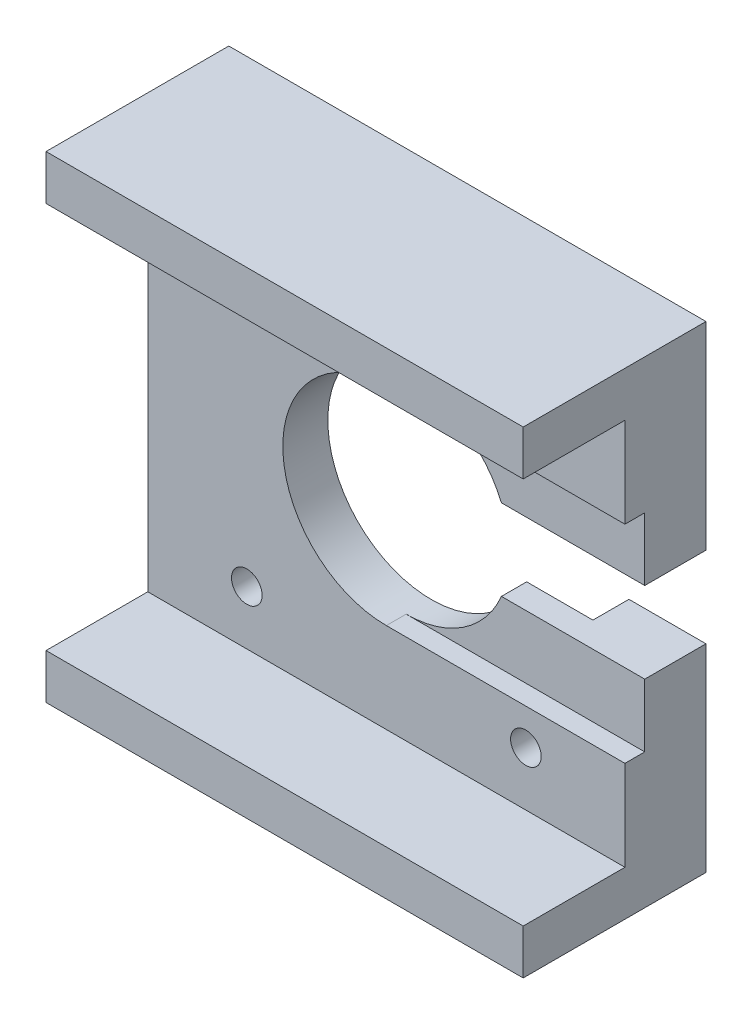
ISO-10303-21;
HEADER;
FILE_DESCRIPTION(('STEP AP214'),'2;1');
FILE_NAME('part.step','',(''),(''),'','','');
FILE_SCHEMA(('AUTOMOTIVE_DESIGN { 1 0 10303 214 1 1 1 1 }'));
ENDSEC;
DATA;
#1=APPLICATION_CONTEXT('core data for automotive mechanical design processes');
#2=APPLICATION_PROTOCOL_DEFINITION('international standard','automotive_design',2000,#1);
#3=PRODUCT_CONTEXT('',#1,'mechanical');
#4=PRODUCT('Part','Part','',(#3));
#5=PRODUCT_RELATED_PRODUCT_CATEGORY('part','',(#4));
#6=PRODUCT_DEFINITION_FORMATION('','',#4);
#7=PRODUCT_DEFINITION_CONTEXT('part definition',#1,'design');
#8=PRODUCT_DEFINITION('design','',#6,#7);
#9=PRODUCT_DEFINITION_SHAPE('','',#8);
#10=(LENGTH_UNIT() NAMED_UNIT(*) SI_UNIT(.MILLI.,.METRE.));
#11=(NAMED_UNIT(*) PLANE_ANGLE_UNIT() SI_UNIT($,.RADIAN.));
#12=(NAMED_UNIT(*) SI_UNIT($,.STERADIAN.) SOLID_ANGLE_UNIT());
#13=UNCERTAINTY_MEASURE_WITH_UNIT(LENGTH_MEASURE(1.E-05),#10,'distance_accuracy_value','');
#14=(GEOMETRIC_REPRESENTATION_CONTEXT(3) GLOBAL_UNCERTAINTY_ASSIGNED_CONTEXT((#13)) GLOBAL_UNIT_ASSIGNED_CONTEXT((#10,
#11,#12)) REPRESENTATION_CONTEXT('',''));
#15=CARTESIAN_POINT('',(0.,0.,0.));
#16=DIRECTION('',(0.,0.,1.));
#17=DIRECTION('',(1.,0.,0.));
#18=AXIS2_PLACEMENT_3D('',#15,#16,#17);
#19=CARTESIAN_POINT('',(15.5,15.5,16.3));
#20=DIRECTION('',(0.,0.,-1.));
#21=DIRECTION('',(-1.,0.,0.));
#22=AXIS2_PLACEMENT_3D('',#19,#20,#21);
#23=CYLINDRICAL_SURFACE('',#22,1.7);
#24=CARTESIAN_POINT('',(15.5,15.5,5.));
#25=DIRECTION('',(0.,0.,1.));
#26=DIRECTION('',(1.,0.,0.));
#27=AXIS2_PLACEMENT_3D('',#24,#25,#26);
#28=CIRCLE('',#27,1.7);
#29=CARTESIAN_POINT('',(17.2,15.5,5.));
#30=VERTEX_POINT('',#29);
#31=EDGE_CURVE('E242',#30,#30,#28,.T.);
#32=ORIENTED_EDGE('',*,*,#31,.T.);
#33=EDGE_LOOP('',(#32));
#34=FACE_BOUND('',#33,.T.);
#35=CARTESIAN_POINT('',(15.5,15.5,-3.5));
#36=DIRECTION('',(0.,0.,-1.));
#37=DIRECTION('',(-1.,0.,0.));
#38=AXIS2_PLACEMENT_3D('',#35,#36,#37);
#39=CIRCLE('',#38,1.7);
#40=CARTESIAN_POINT('',(13.8,15.5,-3.5));
#41=VERTEX_POINT('',#40);
#42=EDGE_CURVE('E50',#41,#41,#39,.F.);
#43=ORIENTED_EDGE('',*,*,#42,.F.);
#44=EDGE_LOOP('',(#43));
#45=FACE_BOUND('',#44,.T.);
#46=ADVANCED_FACE('F46',(#34,#45),#23,.F.);
#47=CARTESIAN_POINT('',(15.5000000000002,-15.4999999999998,16.3));
#48=DIRECTION('',(0.,0.,-1.));
#49=DIRECTION('',(-1.,0.,0.));
#50=AXIS2_PLACEMENT_3D('',#47,#48,#49);
#51=CYLINDRICAL_SURFACE('',#50,1.7);
#52=CARTESIAN_POINT('',(15.5000000000002,-15.4999999999998,5.));
#53=DIRECTION('',(0.,0.,1.));
#54=DIRECTION('',(1.,0.,0.));
#55=AXIS2_PLACEMENT_3D('',#52,#53,#54);
#56=CIRCLE('',#55,1.7);
#57=CARTESIAN_POINT('',(17.2000000000002,-15.4999999999998,5.));
#58=VERTEX_POINT('',#57);
#59=EDGE_CURVE('E183',#58,#58,#56,.T.);
#60=ORIENTED_EDGE('',*,*,#59,.T.);
#61=EDGE_LOOP('',(#60));
#62=FACE_BOUND('',#61,.T.);
#63=CARTESIAN_POINT('',(15.5000000000002,-15.4999999999998,-3.5));
#64=DIRECTION('',(0.,0.,-1.));
#65=DIRECTION('',(-1.,0.,0.));
#66=AXIS2_PLACEMENT_3D('',#63,#64,#65);
#67=CIRCLE('',#66,1.7);
#68=CARTESIAN_POINT('',(13.8000000000002,-15.4999999999998,-3.5));
#69=VERTEX_POINT('',#68);
#70=EDGE_CURVE('E397',#69,#69,#67,.F.);
#71=ORIENTED_EDGE('',*,*,#70,.F.);
#72=EDGE_LOOP('',(#71));
#73=FACE_BOUND('',#72,.T.);
#74=ADVANCED_FACE('F411',(#62,#73),#51,.F.);
#75=CARTESIAN_POINT('',(-15.5,-15.5,16.3));
#76=DIRECTION('',(0.,0.,-1.));
#77=DIRECTION('',(-1.,0.,0.));
#78=AXIS2_PLACEMENT_3D('',#75,#76,#77);
#79=CYLINDRICAL_SURFACE('',#78,1.7);
#80=CARTESIAN_POINT('',(-15.5,-15.5,5.));
#81=DIRECTION('',(0.,0.,1.));
#82=DIRECTION('',(1.,0.,0.));
#83=AXIS2_PLACEMENT_3D('',#80,#81,#82);
#84=CIRCLE('',#83,1.7);
#85=CARTESIAN_POINT('',(-13.8,-15.5,5.));
#86=VERTEX_POINT('',#85);
#87=EDGE_CURVE('E234',#86,#86,#84,.T.);
#88=ORIENTED_EDGE('',*,*,#87,.T.);
#89=EDGE_LOOP('',(#88));
#90=FACE_BOUND('',#89,.T.);
#91=CARTESIAN_POINT('',(-15.5,-15.5,-3.5));
#92=DIRECTION('',(0.,0.,-1.));
#93=DIRECTION('',(-1.,0.,0.));
#94=AXIS2_PLACEMENT_3D('',#91,#92,#93);
#95=CIRCLE('',#94,1.7);
#96=CARTESIAN_POINT('',(-17.2,-15.5,-3.5));
#97=VERTEX_POINT('',#96);
#98=EDGE_CURVE('E393',#97,#97,#95,.F.);
#99=ORIENTED_EDGE('',*,*,#98,.F.);
#100=EDGE_LOOP('',(#99));
#101=FACE_BOUND('',#100,.T.);
#102=ADVANCED_FACE('F417',(#90,#101),#79,.F.);
#103=CARTESIAN_POINT('',(-15.5000000000001,15.4999999999999,16.3));
#104=DIRECTION('',(0.,0.,-1.));
#105=DIRECTION('',(-1.,0.,0.));
#106=AXIS2_PLACEMENT_3D('',#103,#104,#105);
#107=CYLINDRICAL_SURFACE('',#106,1.7);
#108=CARTESIAN_POINT('',(-15.5000000000001,15.4999999999999,5.));
#109=DIRECTION('',(0.,0.,1.));
#110=DIRECTION('',(1.,0.,0.));
#111=AXIS2_PLACEMENT_3D('',#108,#109,#110);
#112=CIRCLE('',#111,1.7);
#113=CARTESIAN_POINT('',(-13.8000000000001,15.4999999999999,5.));
#114=VERTEX_POINT('',#113);
#115=EDGE_CURVE('E238',#114,#114,#112,.T.);
#116=ORIENTED_EDGE('',*,*,#115,.T.);
#117=EDGE_LOOP('',(#116));
#118=FACE_BOUND('',#117,.T.);
#119=CARTESIAN_POINT('',(-15.5000000000001,15.4999999999999,-3.5));
#120=DIRECTION('',(0.,0.,-1.));
#121=DIRECTION('',(-1.,0.,0.));
#122=AXIS2_PLACEMENT_3D('',#119,#120,#121);
#123=CIRCLE('',#122,1.7);
#124=CARTESIAN_POINT('',(-17.2000000000001,15.4999999999999,-3.5));
#125=VERTEX_POINT('',#124);
#126=EDGE_CURVE('E389',#125,#125,#123,.F.);
#127=ORIENTED_EDGE('',*,*,#126,.F.);
#128=EDGE_LOOP('',(#127));
#129=FACE_BOUND('',#128,.T.);
#130=ADVANCED_FACE('F470',(#118,#129),#107,.F.);
#131=CARTESIAN_POINT('',(0.,0.,0.));
#132=DIRECTION('',(0.,0.,1.));
#133=DIRECTION('',(1.,0.,0.));
#134=AXIS2_PLACEMENT_3D('',#131,#132,#133);
#135=PLANE('',#134);
#136=DIRECTION('',(1.,0.,0.));
#137=VECTOR('',#136,1.);
#138=CARTESIAN_POINT('',(0.,-4.5,0.));
#139=LINE('',#138,#137);
#140=CARTESIAN_POINT('',(10.5830052442584,-4.5,0.));
#141=VERTEX_POINT('',#140);
#142=CARTESIAN_POINT('',(17.9443584449264,-4.5,0.));
#143=VERTEX_POINT('',#142);
#144=EDGE_CURVE('E294',#141,#143,#139,.T.);
#145=ORIENTED_EDGE('',*,*,#144,.T.);
#146=CARTESIAN_POINT('',(0.,0.,0.));
#147=DIRECTION('',(0.,0.,-1.));
#148=DIRECTION('',(-1.,0.,0.));
#149=AXIS2_PLACEMENT_3D('',#146,#147,#148);
#150=CIRCLE('',#149,18.5);
#151=CARTESIAN_POINT('',(17.9443584449264,4.5,0.));
#152=VERTEX_POINT('',#151);
#153=EDGE_CURVE('E178',#143,#152,#150,.T.);
#154=ORIENTED_EDGE('',*,*,#153,.T.);
#155=DIRECTION('',(1.,0.,0.));
#156=VECTOR('',#155,1.);
#157=CARTESIAN_POINT('',(0.,4.5,0.));
#158=LINE('',#157,#156);
#159=CARTESIAN_POINT('',(10.5830052442584,4.5,0.));
#160=VERTEX_POINT('',#159);
#161=EDGE_CURVE('E298',#160,#152,#158,.T.);
#162=ORIENTED_EDGE('',*,*,#161,.F.);
#163=CARTESIAN_POINT('',(0.,0.,0.));
#164=DIRECTION('',(0.,0.,1.));
#165=DIRECTION('',(1.,0.,0.));
#166=AXIS2_PLACEMENT_3D('',#163,#164,#165);
#167=CIRCLE('',#166,11.5);
#168=EDGE_CURVE('E290',#160,#141,#167,.T.);
#169=ORIENTED_EDGE('',*,*,#168,.T.);
#170=EDGE_LOOP('',(#145,#154,#162,#169));
#171=FACE_BOUND('',#170,.T.);
#172=ADVANCED_FACE('F467',(#171),#135,.F.);
#173=CARTESIAN_POINT('',(26.5,26.5,5.));
#174=DIRECTION('',(-1.,0.,0.));
#175=DIRECTION('',(0.,0.,1.));
#176=AXIS2_PLACEMENT_3D('',#173,#174,#175);
#177=PLANE('',#176);
#178=DIRECTION('',(0.,0.,1.));
#179=VECTOR('',#178,1.);
#180=CARTESIAN_POINT('',(26.5,11.5,2.8));
#181=LINE('',#180,#179);
#182=CARTESIAN_POINT('',(26.5,11.5,2.8));
#183=VERTEX_POINT('',#182);
#184=CARTESIAN_POINT('',(26.5,11.5,5.));
#185=VERTEX_POINT('',#184);
#186=EDGE_CURVE('E268',#183,#185,#181,.T.);
#187=ORIENTED_EDGE('',*,*,#186,.F.);
#188=DIRECTION('',(0.,1.,0.));
#189=VECTOR('',#188,1.);
#190=CARTESIAN_POINT('',(26.5,0.,2.8));
#191=LINE('',#190,#189);
#192=CARTESIAN_POINT('',(26.5,4.5,2.8));
#193=VERTEX_POINT('',#192);
#194=EDGE_CURVE('E250',#193,#183,#191,.T.);
#195=ORIENTED_EDGE('',*,*,#194,.F.);
#196=DIRECTION('',(0.,0.,1.));
#197=VECTOR('',#196,1.);
#198=CARTESIAN_POINT('',(26.5,4.5,0.));
#199=LINE('',#198,#197);
#200=CARTESIAN_POINT('',(26.5,4.5,-4.));
#201=VERTEX_POINT('',#200);
#202=EDGE_CURVE('E311',#201,#193,#199,.T.);
#203=ORIENTED_EDGE('',*,*,#202,.F.);
#204=DIRECTION('',(0.,-1.,0.));
#205=VECTOR('',#204,1.);
#206=CARTESIAN_POINT('',(26.5,0.,-4.));
#207=LINE('',#206,#205);
#208=CARTESIAN_POINT('',(26.5,26.5,-4.));
#209=VERTEX_POINT('',#208);
#210=EDGE_CURVE('E224',#209,#201,#207,.T.);
#211=ORIENTED_EDGE('',*,*,#210,.F.);
#212=DIRECTION('',(0.,0.,-1.));
#213=VECTOR('',#212,1.);
#214=CARTESIAN_POINT('',(26.5,26.5,5.));
#215=LINE('',#214,#213);
#216=CARTESIAN_POINT('',(26.5,26.5,16.3));
#217=VERTEX_POINT('',#216);
#218=EDGE_CURVE('E11',#217,#209,#215,.T.);
#219=ORIENTED_EDGE('',*,*,#218,.F.);
#220=DIRECTION('',(0.,1.,0.));
#221=VECTOR('',#220,1.);
#222=CARTESIAN_POINT('',(26.5,0.,16.3));
#223=LINE('',#222,#221);
#224=CARTESIAN_POINT('',(26.5,21.5,16.3));
#225=VERTEX_POINT('',#224);
#226=EDGE_CURVE('E351',#225,#217,#223,.T.);
#227=ORIENTED_EDGE('',*,*,#226,.F.);
#228=DIRECTION('',(0.,0.,-1.));
#229=VECTOR('',#228,1.);
#230=CARTESIAN_POINT('',(26.5,21.5,16.3));
#231=LINE('',#230,#229);
#232=CARTESIAN_POINT('',(26.5,21.5,5.));
#233=VERTEX_POINT('',#232);
#234=EDGE_CURVE('E369',#225,#233,#231,.T.);
#235=ORIENTED_EDGE('',*,*,#234,.T.);
#236=DIRECTION('',(0.,1.,0.));
#237=VECTOR('',#236,1.);
#238=CARTESIAN_POINT('',(26.5,26.5,5.));
#239=LINE('',#238,#237);
#240=EDGE_CURVE('E373',#185,#233,#239,.T.);
#241=ORIENTED_EDGE('',*,*,#240,.F.);
#242=EDGE_LOOP('',(#187,#195,#203,#211,#219,#227,#235,#241));
#243=FACE_BOUND('',#242,.T.);
#244=ADVANCED_FACE('F465',(#243),#177,.F.);
#245=CARTESIAN_POINT('',(0.,0.,5.));
#246=DIRECTION('',(0.,0.,1.));
#247=DIRECTION('',(1.,0.,0.));
#248=AXIS2_PLACEMENT_3D('',#245,#246,#247);
#249=PLANE('',#248);
#250=ORIENTED_EDGE('',*,*,#115,.F.);
#251=EDGE_LOOP('',(#250));
#252=FACE_BOUND('',#251,.T.);
#253=ORIENTED_EDGE('',*,*,#87,.F.);
#254=EDGE_LOOP('',(#253));
#255=FACE_BOUND('',#254,.T.);
#256=ORIENTED_EDGE('',*,*,#59,.F.);
#257=EDGE_LOOP('',(#256));
#258=FACE_BOUND('',#257,.T.);
#259=ORIENTED_EDGE('',*,*,#31,.F.);
#260=EDGE_LOOP('',(#259));
#261=FACE_BOUND('',#260,.T.);
#262=DIRECTION('',(1.,0.,0.));
#263=VECTOR('',#262,1.);
#264=CARTESIAN_POINT('',(0.,-11.5,5.));
#265=LINE('',#264,#263);
#266=CARTESIAN_POINT('',(0.,-11.5,5.));
#267=VERTEX_POINT('',#266);
#268=CARTESIAN_POINT('',(26.5,-11.5,5.));
#269=VERTEX_POINT('',#268);
#270=EDGE_CURVE('E251',#267,#269,#265,.T.);
#271=ORIENTED_EDGE('',*,*,#270,.F.);
#272=CARTESIAN_POINT('',(0.,0.,5.));
#273=DIRECTION('',(0.,0.,1.));
#274=DIRECTION('',(1.,0.,0.));
#275=AXIS2_PLACEMENT_3D('',#272,#273,#274);
#276=CIRCLE('',#275,11.5);
#277=CARTESIAN_POINT('',(0.,11.5,5.));
#278=VERTEX_POINT('',#277);
#279=EDGE_CURVE('E295',#278,#267,#276,.T.);
#280=ORIENTED_EDGE('',*,*,#279,.F.);
#281=DIRECTION('',(1.,0.,0.));
#282=VECTOR('',#281,1.);
#283=CARTESIAN_POINT('',(0.,11.5,5.));
#284=LINE('',#283,#282);
#285=EDGE_CURVE('E246',#278,#185,#284,.T.);
#286=ORIENTED_EDGE('',*,*,#285,.T.);
#287=ORIENTED_EDGE('',*,*,#240,.T.);
#288=DIRECTION('',(1.,0.,0.));
#289=VECTOR('',#288,1.);
#290=CARTESIAN_POINT('',(0.,21.5,5.));
#291=LINE('',#290,#289);
#292=CARTESIAN_POINT('',(-26.5,21.5,5.));
#293=VERTEX_POINT('',#292);
#294=EDGE_CURVE('E346',#293,#233,#291,.T.);
#295=ORIENTED_EDGE('',*,*,#294,.F.);
#296=DIRECTION('',(0.,-1.,0.));
#297=VECTOR('',#296,1.);
#298=CARTESIAN_POINT('',(-26.5,26.5,5.));
#299=LINE('',#298,#297);
#300=CARTESIAN_POINT('',(-26.5,-21.5,5.));
#301=VERTEX_POINT('',#300);
#302=EDGE_CURVE('E378',#293,#301,#299,.T.);
#303=ORIENTED_EDGE('',*,*,#302,.T.);
#304=DIRECTION('',(1.,0.,0.));
#305=VECTOR('',#304,1.);
#306=CARTESIAN_POINT('',(0.,-21.5,5.));
#307=LINE('',#306,#305);
#308=CARTESIAN_POINT('',(26.5,-21.5,5.));
#309=VERTEX_POINT('',#308);
#310=EDGE_CURVE('E310',#301,#309,#307,.T.);
#311=ORIENTED_EDGE('',*,*,#310,.T.);
#312=EDGE_CURVE('E374',#309,#269,#239,.T.);
#313=ORIENTED_EDGE('',*,*,#312,.T.);
#314=EDGE_LOOP('',(#271,#280,#286,#287,#295,#303,#311,#313));
#315=FACE_BOUND('',#314,.T.);
#316=ADVANCED_FACE('F445',(#252,#255,#258,#261,#315),#249,.T.);
#317=CARTESIAN_POINT('',(0.,0.,0.));
#318=DIRECTION('',(0.,0.,1.));
#319=DIRECTION('',(1.,0.,0.));
#320=AXIS2_PLACEMENT_3D('',#317,#318,#319);
#321=CYLINDRICAL_SURFACE('',#320,11.5);
#322=CARTESIAN_POINT('',(0.,0.,2.8));
#323=DIRECTION('',(0.,0.,1.));
#324=DIRECTION('',(1.,0.,0.));
#325=AXIS2_PLACEMENT_3D('',#322,#323,#324);
#326=CIRCLE('',#325,11.5);
#327=CARTESIAN_POINT('',(10.5830052442584,-4.5,2.8));
#328=VERTEX_POINT('',#327);
#329=CARTESIAN_POINT('',(0.,-11.5,2.8));
#330=VERTEX_POINT('',#329);
#331=EDGE_CURVE('E289',#328,#330,#326,.F.);
#332=ORIENTED_EDGE('',*,*,#331,.F.);
#333=DIRECTION('',(0.,0.,1.));
#334=VECTOR('',#333,1.);
#335=CARTESIAN_POINT('',(10.5830052442584,-4.5,0.));
#336=LINE('',#335,#334);
#337=EDGE_CURVE('E302',#141,#328,#336,.T.);
#338=ORIENTED_EDGE('',*,*,#337,.F.);
#339=ORIENTED_EDGE('',*,*,#168,.F.);
#340=DIRECTION('',(0.,0.,1.));
#341=VECTOR('',#340,1.);
#342=CARTESIAN_POINT('',(10.5830052442584,4.5,0.));
#343=LINE('',#342,#341);
#344=CARTESIAN_POINT('',(10.5830052442584,4.5,2.8));
#345=VERTEX_POINT('',#344);
#346=EDGE_CURVE('E306',#160,#345,#343,.T.);
#347=ORIENTED_EDGE('',*,*,#346,.T.);
#348=CARTESIAN_POINT('',(0.,11.5,2.8));
#349=VERTEX_POINT('',#348);
#350=EDGE_CURVE('E72',#349,#345,#326,.F.);
#351=ORIENTED_EDGE('',*,*,#350,.F.);
#352=DIRECTION('',(0.,0.,1.));
#353=VECTOR('',#352,1.);
#354=CARTESIAN_POINT('',(0.,11.5,2.8));
#355=LINE('',#354,#353);
#356=EDGE_CURVE('E281',#349,#278,#355,.T.);
#357=ORIENTED_EDGE('',*,*,#356,.T.);
#358=ORIENTED_EDGE('',*,*,#279,.T.);
#359=DIRECTION('',(0.,0.,1.));
#360=VECTOR('',#359,1.);
#361=CARTESIAN_POINT('',(0.,-11.5,2.8));
#362=LINE('',#361,#360);
#363=EDGE_CURVE('E278',#330,#267,#362,.T.);
#364=ORIENTED_EDGE('',*,*,#363,.F.);
#365=EDGE_LOOP('',(#332,#338,#339,#347,#351,#357,#358,#364));
#366=FACE_BOUND('',#365,.T.);
#367=ADVANCED_FACE('F439',(#366),#321,.F.);
#368=CARTESIAN_POINT('',(0.,4.5,0.));
#369=DIRECTION('',(0.,-1.,0.));
#370=DIRECTION('',(0.,0.,-1.));
#371=AXIS2_PLACEMENT_3D('',#368,#369,#370);
#372=PLANE('',#371);
#373=ORIENTED_EDGE('',*,*,#202,.T.);
#374=DIRECTION('',(1.,0.,0.));
#375=VECTOR('',#374,1.);
#376=CARTESIAN_POINT('',(0.,4.5,2.8));
#377=LINE('',#376,#375);
#378=EDGE_CURVE('E247',#345,#193,#377,.T.);
#379=ORIENTED_EDGE('',*,*,#378,.F.);
#380=ORIENTED_EDGE('',*,*,#346,.F.);
#381=ORIENTED_EDGE('',*,*,#161,.T.);
#382=DIRECTION('',(0.,0.,1.));
#383=VECTOR('',#382,1.);
#384=CARTESIAN_POINT('',(17.9443584449264,4.5,-4.));
#385=LINE('',#384,#383);
#386=CARTESIAN_POINT('',(17.9443584449264,4.5,-4.));
#387=VERTEX_POINT('',#386);
#388=EDGE_CURVE('E64',#387,#152,#385,.T.);
#389=ORIENTED_EDGE('',*,*,#388,.F.);
#390=DIRECTION('',(-1.,0.,0.));
#391=VECTOR('',#390,1.);
#392=CARTESIAN_POINT('',(0.,4.5,-4.));
#393=LINE('',#392,#391);
#394=EDGE_CURVE('E200',#201,#387,#393,.T.);
#395=ORIENTED_EDGE('',*,*,#394,.F.);
#396=EDGE_LOOP('',(#373,#379,#380,#381,#389,#395));
#397=FACE_BOUND('',#396,.T.);
#398=ADVANCED_FACE('F436',(#397),#372,.T.);
#399=CARTESIAN_POINT('',(0.,-4.5,0.));
#400=DIRECTION('',(0.,-1.,0.));
#401=DIRECTION('',(0.,0.,-1.));
#402=AXIS2_PLACEMENT_3D('',#399,#400,#401);
#403=PLANE('',#402);
#404=DIRECTION('',(-1.,0.,0.));
#405=VECTOR('',#404,1.);
#406=CARTESIAN_POINT('',(0.,-4.5,2.8));
#407=LINE('',#406,#405);
#408=CARTESIAN_POINT('',(26.5,-4.5,2.8));
#409=VERTEX_POINT('',#408);
#410=EDGE_CURVE('E265',#409,#328,#407,.T.);
#411=ORIENTED_EDGE('',*,*,#410,.F.);
#412=DIRECTION('',(0.,0.,1.));
#413=VECTOR('',#412,1.);
#414=CARTESIAN_POINT('',(26.5,-4.5,0.));
#415=LINE('',#414,#413);
#416=CARTESIAN_POINT('',(26.5,-4.5,-4.));
#417=VERTEX_POINT('',#416);
#418=EDGE_CURVE('E190',#417,#409,#415,.T.);
#419=ORIENTED_EDGE('',*,*,#418,.F.);
#420=DIRECTION('',(1.,0.,0.));
#421=VECTOR('',#420,1.);
#422=CARTESIAN_POINT('',(0.,-4.5,-4.));
#423=LINE('',#422,#421);
#424=CARTESIAN_POINT('',(17.9443584449264,-4.5,-4.));
#425=VERTEX_POINT('',#424);
#426=EDGE_CURVE('E186',#425,#417,#423,.T.);
#427=ORIENTED_EDGE('',*,*,#426,.F.);
#428=DIRECTION('',(0.,0.,1.));
#429=VECTOR('',#428,1.);
#430=CARTESIAN_POINT('',(17.9443584449264,-4.5,-4.));
#431=LINE('',#430,#429);
#432=EDGE_CURVE('E173',#425,#143,#431,.T.);
#433=ORIENTED_EDGE('',*,*,#432,.T.);
#434=ORIENTED_EDGE('',*,*,#144,.F.);
#435=ORIENTED_EDGE('',*,*,#337,.T.);
#436=EDGE_LOOP('',(#411,#419,#427,#433,#434,#435));
#437=FACE_BOUND('',#436,.T.);
#438=ADVANCED_FACE('F188',(#437),#403,.F.);
#439=DIRECTION('',(0.,1.,0.));
#440=VECTOR('',#439,1.);
#441=CARTESIAN_POINT('',(26.5,0.,2.8));
#442=LINE('',#441,#440);
#443=CARTESIAN_POINT('',(26.5,-11.5,2.8));
#444=VERTEX_POINT('',#443);
#445=EDGE_CURVE('E262',#444,#409,#442,.T.);
#446=ORIENTED_EDGE('',*,*,#445,.F.);
#447=DIRECTION('',(0.,0.,1.));
#448=VECTOR('',#447,1.);
#449=CARTESIAN_POINT('',(26.5,-11.5,2.8));
#450=LINE('',#449,#448);
#451=EDGE_CURVE('E274',#444,#269,#450,.T.);
#452=ORIENTED_EDGE('',*,*,#451,.T.);
#453=ORIENTED_EDGE('',*,*,#312,.F.);
#454=DIRECTION('',(0.,0.,-1.));
#455=VECTOR('',#454,1.);
#456=CARTESIAN_POINT('',(26.5,-21.5,16.3));
#457=LINE('',#456,#455);
#458=CARTESIAN_POINT('',(26.5,-21.5,16.3));
#459=VERTEX_POINT('',#458);
#460=EDGE_CURVE('E335',#459,#309,#457,.T.);
#461=ORIENTED_EDGE('',*,*,#460,.F.);
#462=DIRECTION('',(0.,1.,0.));
#463=VECTOR('',#462,1.);
#464=CARTESIAN_POINT('',(26.5,0.,16.3));
#465=LINE('',#464,#463);
#466=CARTESIAN_POINT('',(26.5,-26.5,16.3));
#467=VERTEX_POINT('',#466);
#468=EDGE_CURVE('E332',#467,#459,#465,.T.);
#469=ORIENTED_EDGE('',*,*,#468,.F.);
#470=DIRECTION('',(0.,0.,-1.));
#471=VECTOR('',#470,1.);
#472=CARTESIAN_POINT('',(26.5,-26.5,5.));
#473=LINE('',#472,#471);
#474=CARTESIAN_POINT('',(26.5,-26.5,-4.));
#475=VERTEX_POINT('',#474);
#476=EDGE_CURVE('E381',#467,#475,#473,.T.);
#477=ORIENTED_EDGE('',*,*,#476,.T.);
#478=DIRECTION('',(0.,-1.,0.));
#479=VECTOR('',#478,1.);
#480=CARTESIAN_POINT('',(26.5,0.,-4.));
#481=LINE('',#480,#479);
#482=EDGE_CURVE('E195',#417,#475,#481,.T.);
#483=ORIENTED_EDGE('',*,*,#482,.F.);
#484=ORIENTED_EDGE('',*,*,#418,.T.);
#485=EDGE_LOOP('',(#446,#452,#453,#461,#469,#477,#483,#484));
#486=FACE_BOUND('',#485,.T.);
#487=ADVANCED_FACE('F48',(#486),#177,.F.);
#488=CARTESIAN_POINT('',(-26.5,26.5,5.));
#489=DIRECTION('',(0.,-1.,0.));
#490=DIRECTION('',(0.,0.,-1.));
#491=AXIS2_PLACEMENT_3D('',#488,#489,#490);
#492=PLANE('',#491);
#493=ORIENTED_EDGE('',*,*,#218,.T.);
#494=DIRECTION('',(1.,0.,0.));
#495=VECTOR('',#494,1.);
#496=CARTESIAN_POINT('',(0.,26.5,-4.));
#497=LINE('',#496,#495);
#498=CARTESIAN_POINT('',(-26.5,26.5,-4.));
#499=VERTEX_POINT('',#498);
#500=EDGE_CURVE('E220',#499,#209,#497,.T.);
#501=ORIENTED_EDGE('',*,*,#500,.F.);
#502=DIRECTION('',(0.,0.,-1.));
#503=VECTOR('',#502,1.);
#504=CARTESIAN_POINT('',(-26.5,26.5,5.));
#505=LINE('',#504,#503);
#506=CARTESIAN_POINT('',(-26.5,26.5,16.3));
#507=VERTEX_POINT('',#506);
#508=EDGE_CURVE('E56',#507,#499,#505,.T.);
#509=ORIENTED_EDGE('',*,*,#508,.F.);
#510=DIRECTION('',(-1.,0.,0.));
#511=VECTOR('',#510,1.);
#512=CARTESIAN_POINT('',(0.,26.5,16.3));
#513=LINE('',#512,#511);
#514=EDGE_CURVE('E355',#217,#507,#513,.T.);
#515=ORIENTED_EDGE('',*,*,#514,.F.);
#516=EDGE_LOOP('',(#493,#501,#509,#515));
#517=FACE_BOUND('',#516,.T.);
#518=ADVANCED_FACE('F477',(#517),#492,.F.);
#519=CARTESIAN_POINT('',(-26.5,26.5,5.));
#520=DIRECTION('',(1.,0.,0.));
#521=DIRECTION('',(0.,0.,-1.));
#522=AXIS2_PLACEMENT_3D('',#519,#520,#521);
#523=PLANE('',#522);
#524=ORIENTED_EDGE('',*,*,#508,.T.);
#525=DIRECTION('',(0.,1.,0.));
#526=VECTOR('',#525,1.);
#527=CARTESIAN_POINT('',(-26.5,0.,-4.));
#528=LINE('',#527,#526);
#529=CARTESIAN_POINT('',(-26.5,-26.5,-4.));
#530=VERTEX_POINT('',#529);
#531=EDGE_CURVE('E216',#530,#499,#528,.T.);
#532=ORIENTED_EDGE('',*,*,#531,.F.);
#533=DIRECTION('',(0.,0.,-1.));
#534=VECTOR('',#533,1.);
#535=CARTESIAN_POINT('',(-26.5,-26.5,5.));
#536=LINE('',#535,#534);
#537=CARTESIAN_POINT('',(-26.5,-26.5,16.3));
#538=VERTEX_POINT('',#537);
#539=EDGE_CURVE('E384',#538,#530,#536,.T.);
#540=ORIENTED_EDGE('',*,*,#539,.F.);
#541=DIRECTION('',(0.,-1.,0.));
#542=VECTOR('',#541,1.);
#543=CARTESIAN_POINT('',(-26.5,0.,16.3));
#544=LINE('',#543,#542);
#545=CARTESIAN_POINT('',(-26.5,-21.5,16.3));
#546=VERTEX_POINT('',#545);
#547=EDGE_CURVE('E324',#546,#538,#544,.T.);
#548=ORIENTED_EDGE('',*,*,#547,.F.);
#549=DIRECTION('',(0.,0.,-1.));
#550=VECTOR('',#549,1.);
#551=CARTESIAN_POINT('',(-26.5,-21.5,16.3));
#552=LINE('',#551,#550);
#553=EDGE_CURVE('E342',#546,#301,#552,.T.);
#554=ORIENTED_EDGE('',*,*,#553,.T.);
#555=ORIENTED_EDGE('',*,*,#302,.F.);
#556=DIRECTION('',(0.,0.,-1.));
#557=VECTOR('',#556,1.);
#558=CARTESIAN_POINT('',(-26.5,21.5,16.3));
#559=LINE('',#558,#557);
#560=CARTESIAN_POINT('',(-26.5,21.5,16.3));
#561=VERTEX_POINT('',#560);
#562=EDGE_CURVE('E362',#561,#293,#559,.T.);
#563=ORIENTED_EDGE('',*,*,#562,.F.);
#564=DIRECTION('',(0.,-1.,0.));
#565=VECTOR('',#564,1.);
#566=CARTESIAN_POINT('',(-26.5,0.,16.3));
#567=LINE('',#566,#565);
#568=EDGE_CURVE('E359',#507,#561,#567,.T.);
#569=ORIENTED_EDGE('',*,*,#568,.F.);
#570=EDGE_LOOP('',(#524,#532,#540,#548,#554,#555,#563,#569));
#571=FACE_BOUND('',#570,.T.);
#572=ADVANCED_FACE('F474',(#571),#523,.F.);
#573=CARTESIAN_POINT('',(-26.5,-26.5,5.));
#574=DIRECTION('',(0.,1.,0.));
#575=DIRECTION('',(0.,0.,1.));
#576=AXIS2_PLACEMENT_3D('',#573,#574,#575);
#577=PLANE('',#576);
#578=ORIENTED_EDGE('',*,*,#539,.T.);
#579=DIRECTION('',(-1.,0.,0.));
#580=VECTOR('',#579,1.);
#581=CARTESIAN_POINT('',(0.,-26.5,-4.));
#582=LINE('',#581,#580);
#583=EDGE_CURVE('E212',#475,#530,#582,.T.);
#584=ORIENTED_EDGE('',*,*,#583,.F.);
#585=ORIENTED_EDGE('',*,*,#476,.F.);
#586=DIRECTION('',(1.,0.,0.));
#587=VECTOR('',#586,1.);
#588=CARTESIAN_POINT('',(0.,-26.5,16.3));
#589=LINE('',#588,#587);
#590=EDGE_CURVE('E328',#538,#467,#589,.T.);
#591=ORIENTED_EDGE('',*,*,#590,.F.);
#592=EDGE_LOOP('',(#578,#584,#585,#591));
#593=FACE_BOUND('',#592,.T.);
#594=ADVANCED_FACE('F461',(#593),#577,.F.);
#595=CARTESIAN_POINT('',(0.,21.5,16.3));
#596=DIRECTION('',(0.,1.,0.));
#597=DIRECTION('',(0.,0.,1.));
#598=AXIS2_PLACEMENT_3D('',#595,#596,#597);
#599=PLANE('',#598);
#600=ORIENTED_EDGE('',*,*,#294,.T.);
#601=ORIENTED_EDGE('',*,*,#234,.F.);
#602=DIRECTION('',(1.,0.,0.));
#603=VECTOR('',#602,1.);
#604=CARTESIAN_POINT('',(0.,21.5,16.3));
#605=LINE('',#604,#603);
#606=EDGE_CURVE('E347',#561,#225,#605,.T.);
#607=ORIENTED_EDGE('',*,*,#606,.F.);
#608=ORIENTED_EDGE('',*,*,#562,.T.);
#609=EDGE_LOOP('',(#600,#601,#607,#608));
#610=FACE_BOUND('',#609,.T.);
#611=ADVANCED_FACE('F457',(#610),#599,.F.);
#612=CARTESIAN_POINT('',(0.,0.,16.3));
#613=DIRECTION('',(0.,0.,1.));
#614=DIRECTION('',(1.,0.,0.));
#615=AXIS2_PLACEMENT_3D('',#612,#613,#614);
#616=PLANE('',#615);
#617=ORIENTED_EDGE('',*,*,#606,.T.);
#618=ORIENTED_EDGE('',*,*,#226,.T.);
#619=ORIENTED_EDGE('',*,*,#514,.T.);
#620=ORIENTED_EDGE('',*,*,#568,.T.);
#621=EDGE_LOOP('',(#617,#618,#619,#620));
#622=FACE_BOUND('',#621,.T.);
#623=ADVANCED_FACE('F453',(#622),#616,.T.);
#624=CARTESIAN_POINT('',(0.,-21.5,16.3));
#625=DIRECTION('',(0.,1.,0.));
#626=DIRECTION('',(0.,0.,1.));
#627=AXIS2_PLACEMENT_3D('',#624,#625,#626);
#628=PLANE('',#627);
#629=ORIENTED_EDGE('',*,*,#310,.F.);
#630=ORIENTED_EDGE('',*,*,#553,.F.);
#631=DIRECTION('',(1.,0.,0.));
#632=VECTOR('',#631,1.);
#633=CARTESIAN_POINT('',(0.,-21.5,16.3));
#634=LINE('',#633,#632);
#635=EDGE_CURVE('E320',#546,#459,#634,.T.);
#636=ORIENTED_EDGE('',*,*,#635,.T.);
#637=ORIENTED_EDGE('',*,*,#460,.T.);
#638=EDGE_LOOP('',(#629,#630,#636,#637));
#639=FACE_BOUND('',#638,.T.);
#640=ADVANCED_FACE('F449',(#639),#628,.T.);
#641=CARTESIAN_POINT('',(0.,0.,16.3));
#642=DIRECTION('',(0.,0.,1.));
#643=DIRECTION('',(1.,0.,0.));
#644=AXIS2_PLACEMENT_3D('',#641,#642,#643);
#645=PLANE('',#644);
#646=ORIENTED_EDGE('',*,*,#635,.F.);
#647=ORIENTED_EDGE('',*,*,#547,.T.);
#648=ORIENTED_EDGE('',*,*,#590,.T.);
#649=ORIENTED_EDGE('',*,*,#468,.T.);
#650=EDGE_LOOP('',(#646,#647,#648,#649));
#651=FACE_BOUND('',#650,.T.);
#652=ADVANCED_FACE('F426',(#651),#645,.T.);
#653=CARTESIAN_POINT('',(0.,0.,2.8));
#654=DIRECTION('',(0.,0.,1.));
#655=DIRECTION('',(1.,0.,0.));
#656=AXIS2_PLACEMENT_3D('',#653,#654,#655);
#657=PLANE('',#656);
#658=ORIENTED_EDGE('',*,*,#331,.T.);
#659=DIRECTION('',(1.,0.,0.));
#660=VECTOR('',#659,1.);
#661=CARTESIAN_POINT('',(0.,-11.5,2.8));
#662=LINE('',#661,#660);
#663=EDGE_CURVE('E258',#330,#444,#662,.T.);
#664=ORIENTED_EDGE('',*,*,#663,.T.);
#665=ORIENTED_EDGE('',*,*,#445,.T.);
#666=ORIENTED_EDGE('',*,*,#410,.T.);
#667=EDGE_LOOP('',(#658,#664,#665,#666));
#668=FACE_BOUND('',#667,.T.);
#669=ADVANCED_FACE('F422',(#668),#657,.T.);
#670=CARTESIAN_POINT('',(0.,-11.5,2.8));
#671=DIRECTION('',(0.,-1.,0.));
#672=DIRECTION('',(1.,0.,0.));
#673=AXIS2_PLACEMENT_3D('',#670,#671,#672);
#674=PLANE('',#673);
#675=ORIENTED_EDGE('',*,*,#270,.T.);
#676=ORIENTED_EDGE('',*,*,#451,.F.);
#677=ORIENTED_EDGE('',*,*,#663,.F.);
#678=ORIENTED_EDGE('',*,*,#363,.T.);
#679=EDGE_LOOP('',(#675,#676,#677,#678));
#680=FACE_BOUND('',#679,.T.);
#681=ADVANCED_FACE('F425',(#680),#674,.F.);
#682=ORIENTED_EDGE('',*,*,#350,.T.);
#683=ORIENTED_EDGE('',*,*,#378,.T.);
#684=ORIENTED_EDGE('',*,*,#194,.T.);
#685=DIRECTION('',(1.,0.,0.));
#686=VECTOR('',#685,1.);
#687=CARTESIAN_POINT('',(0.,11.5,2.8));
#688=LINE('',#687,#686);
#689=EDGE_CURVE('E255',#349,#183,#688,.T.);
#690=ORIENTED_EDGE('',*,*,#689,.F.);
#691=EDGE_LOOP('',(#682,#683,#684,#690));
#692=FACE_BOUND('',#691,.T.);
#693=ADVANCED_FACE('F428',(#692),#657,.T.);
#694=CARTESIAN_POINT('',(0.,11.5,2.8));
#695=DIRECTION('',(0.,-1.,0.));
#696=DIRECTION('',(0.,0.,-1.));
#697=AXIS2_PLACEMENT_3D('',#694,#695,#696);
#698=PLANE('',#697);
#699=ORIENTED_EDGE('',*,*,#285,.F.);
#700=ORIENTED_EDGE('',*,*,#356,.F.);
#701=ORIENTED_EDGE('',*,*,#689,.T.);
#702=ORIENTED_EDGE('',*,*,#186,.T.);
#703=EDGE_LOOP('',(#699,#700,#701,#702));
#704=FACE_BOUND('',#703,.T.);
#705=ADVANCED_FACE('F432',(#704),#698,.T.);
#706=CARTESIAN_POINT('',(0.,0.,-4.));
#707=DIRECTION('',(0.,0.,1.));
#708=DIRECTION('',(1.,0.,0.));
#709=AXIS2_PLACEMENT_3D('',#706,#707,#708);
#710=CYLINDRICAL_SURFACE('',#709,18.5);
#711=ORIENTED_EDGE('',*,*,#153,.F.);
#712=ORIENTED_EDGE('',*,*,#432,.F.);
#713=CARTESIAN_POINT('',(0.,0.,-4.));
#714=DIRECTION('',(0.,0.,-1.));
#715=DIRECTION('',(-1.,0.,0.));
#716=AXIS2_PLACEMENT_3D('',#713,#714,#715);
#717=CIRCLE('',#716,18.5);
#718=EDGE_CURVE('E177',#425,#387,#717,.T.);
#719=ORIENTED_EDGE('',*,*,#718,.T.);
#720=ORIENTED_EDGE('',*,*,#388,.T.);
#721=EDGE_LOOP('',(#711,#712,#719,#720));
#722=FACE_BOUND('',#721,.T.);
#723=ADVANCED_FACE('F175',(#722),#710,.F.);
#724=CARTESIAN_POINT('',(0.,0.,-4.));
#725=DIRECTION('',(0.,0.,-1.));
#726=DIRECTION('',(-1.,0.,0.));
#727=AXIS2_PLACEMENT_3D('',#724,#725,#726);
#728=PLANE('',#727);
#729=CARTESIAN_POINT('',(15.5000000000002,-15.4999999999998,-4.));
#730=DIRECTION('',(0.,0.,-1.));
#731=DIRECTION('',(-1.,0.,0.));
#732=AXIS2_PLACEMENT_3D('',#729,#730,#731);
#733=CIRCLE('',#732,2.95);
#734=CARTESIAN_POINT('',(12.5500000000002,-15.4999999999998,-4.));
#735=VERTEX_POINT('',#734);
#736=EDGE_CURVE('E1023',#735,#735,#733,.T.);
#737=ORIENTED_EDGE('',*,*,#736,.F.);
#738=EDGE_LOOP('',(#737));
#739=FACE_BOUND('',#738,.T.);
#740=CARTESIAN_POINT('',(-15.5,-15.5,-4.));
#741=DIRECTION('',(0.,0.,-1.));
#742=DIRECTION('',(-1.,0.,0.));
#743=AXIS2_PLACEMENT_3D('',#740,#741,#742);
#744=CIRCLE('',#743,2.95);
#745=CARTESIAN_POINT('',(-18.45,-15.5,-4.));
#746=VERTEX_POINT('',#745);
#747=EDGE_CURVE('E1028',#746,#746,#744,.T.);
#748=ORIENTED_EDGE('',*,*,#747,.F.);
#749=EDGE_LOOP('',(#748));
#750=FACE_BOUND('',#749,.T.);
#751=CARTESIAN_POINT('',(-15.5000000000001,15.4999999999999,-4.));
#752=DIRECTION('',(0.,0.,-1.));
#753=DIRECTION('',(-1.,0.,0.));
#754=AXIS2_PLACEMENT_3D('',#751,#752,#753);
#755=CIRCLE('',#754,2.95);
#756=CARTESIAN_POINT('',(-18.4500000000001,15.4999999999999,-4.));
#757=VERTEX_POINT('',#756);
#758=EDGE_CURVE('E1043',#757,#757,#755,.T.);
#759=ORIENTED_EDGE('',*,*,#758,.F.);
#760=EDGE_LOOP('',(#759));
#761=FACE_BOUND('',#760,.T.);
#762=CARTESIAN_POINT('',(15.5,15.5,-4.));
#763=DIRECTION('',(0.,0.,-1.));
#764=DIRECTION('',(-1.,0.,0.));
#765=AXIS2_PLACEMENT_3D('',#762,#763,#764);
#766=CIRCLE('',#765,2.95);
#767=CARTESIAN_POINT('',(12.55,15.5,-4.));
#768=VERTEX_POINT('',#767);
#769=EDGE_CURVE('E207',#768,#768,#766,.T.);
#770=ORIENTED_EDGE('',*,*,#769,.F.);
#771=EDGE_LOOP('',(#770));
#772=FACE_BOUND('',#771,.T.);
#773=ORIENTED_EDGE('',*,*,#718,.F.);
#774=ORIENTED_EDGE('',*,*,#426,.T.);
#775=ORIENTED_EDGE('',*,*,#482,.T.);
#776=ORIENTED_EDGE('',*,*,#583,.T.);
#777=ORIENTED_EDGE('',*,*,#531,.T.);
#778=ORIENTED_EDGE('',*,*,#500,.T.);
#779=ORIENTED_EDGE('',*,*,#210,.T.);
#780=ORIENTED_EDGE('',*,*,#394,.T.);
#781=EDGE_LOOP('',(#773,#774,#775,#776,#777,#778,#779,#780));
#782=FACE_BOUND('',#781,.T.);
#783=ADVANCED_FACE('F197',(#739,#750,#761,#772,#782),#728,.T.);
#784=CARTESIAN_POINT('',(15.5,15.5,-3.5));
#785=DIRECTION('',(0.,0.,-1.));
#786=DIRECTION('',(-1.,0.,0.));
#787=AXIS2_PLACEMENT_3D('',#784,#785,#786);
#788=PLANE('',#787);
#789=CARTESIAN_POINT('',(15.5,15.5,-3.5));
#790=DIRECTION('',(0.,0.,-1.));
#791=DIRECTION('',(-1.,0.,0.));
#792=AXIS2_PLACEMENT_3D('',#789,#790,#791);
#793=CIRCLE('',#792,2.95);
#794=CARTESIAN_POINT('',(12.55,15.5,-3.5));
#795=VERTEX_POINT('',#794);
#796=EDGE_CURVE('E394',#795,#795,#793,.T.);
#797=ORIENTED_EDGE('',*,*,#796,.T.);
#798=EDGE_LOOP('',(#797));
#799=FACE_BOUND('',#798,.T.);
#800=ORIENTED_EDGE('',*,*,#42,.T.);
#801=EDGE_LOOP('',(#800));
#802=FACE_BOUND('',#801,.T.);
#803=ADVANCED_FACE('F408',(#799,#802),#788,.T.);
#804=CARTESIAN_POINT('',(15.5,15.5,-3.5));
#805=DIRECTION('',(0.,0.,-1.));
#806=DIRECTION('',(-1.,0.,0.));
#807=AXIS2_PLACEMENT_3D('',#804,#805,#806);
#808=CYLINDRICAL_SURFACE('',#807,2.95);
#809=ORIENTED_EDGE('',*,*,#796,.F.);
#810=EDGE_LOOP('',(#809));
#811=FACE_BOUND('',#810,.T.);
#812=ORIENTED_EDGE('',*,*,#769,.T.);
#813=EDGE_LOOP('',(#812));
#814=FACE_BOUND('',#813,.T.);
#815=ADVANCED_FACE('F598',(#811,#814),#808,.F.);
#816=CARTESIAN_POINT('',(-15.5000000000001,15.4999999999999,-3.5));
#817=DIRECTION('',(0.,0.,-1.));
#818=DIRECTION('',(-1.,0.,0.));
#819=AXIS2_PLACEMENT_3D('',#816,#817,#818);
#820=PLANE('',#819);
#821=CARTESIAN_POINT('',(-15.5000000000001,15.4999999999999,-3.5));
#822=DIRECTION('',(0.,0.,-1.));
#823=DIRECTION('',(-1.,0.,0.));
#824=AXIS2_PLACEMENT_3D('',#821,#822,#823);
#825=CIRCLE('',#824,2.95);
#826=CARTESIAN_POINT('',(-18.4500000000001,15.4999999999999,-3.5));
#827=VERTEX_POINT('',#826);
#828=EDGE_CURVE('E1037',#827,#827,#825,.T.);
#829=ORIENTED_EDGE('',*,*,#828,.T.);
#830=EDGE_LOOP('',(#829));
#831=FACE_BOUND('',#830,.T.);
#832=ORIENTED_EDGE('',*,*,#126,.T.);
#833=EDGE_LOOP('',(#832));
#834=FACE_BOUND('',#833,.T.);
#835=ADVANCED_FACE('F606',(#831,#834),#820,.T.);
#836=CARTESIAN_POINT('',(-15.5000000000001,15.4999999999999,-3.5));
#837=DIRECTION('',(0.,0.,-1.));
#838=DIRECTION('',(-1.,0.,0.));
#839=AXIS2_PLACEMENT_3D('',#836,#837,#838);
#840=CYLINDRICAL_SURFACE('',#839,2.95);
#841=ORIENTED_EDGE('',*,*,#828,.F.);
#842=EDGE_LOOP('',(#841));
#843=FACE_BOUND('',#842,.T.);
#844=ORIENTED_EDGE('',*,*,#758,.T.);
#845=EDGE_LOOP('',(#844));
#846=FACE_BOUND('',#845,.T.);
#847=ADVANCED_FACE('F614',(#843,#846),#840,.F.);
#848=CARTESIAN_POINT('',(-15.5,-15.5,-3.5));
#849=DIRECTION('',(0.,0.,-1.));
#850=DIRECTION('',(-1.,0.,0.));
#851=AXIS2_PLACEMENT_3D('',#848,#849,#850);
#852=PLANE('',#851);
#853=CARTESIAN_POINT('',(-15.5,-15.5,-3.5));
#854=DIRECTION('',(0.,0.,-1.));
#855=DIRECTION('',(-1.,0.,0.));
#856=AXIS2_PLACEMENT_3D('',#853,#854,#855);
#857=CIRCLE('',#856,2.95);
#858=CARTESIAN_POINT('',(-18.45,-15.5,-3.5));
#859=VERTEX_POINT('',#858);
#860=EDGE_CURVE('E1049',#859,#859,#857,.T.);
#861=ORIENTED_EDGE('',*,*,#860,.T.);
#862=EDGE_LOOP('',(#861));
#863=FACE_BOUND('',#862,.T.);
#864=ORIENTED_EDGE('',*,*,#98,.T.);
#865=EDGE_LOOP('',(#864));
#866=FACE_BOUND('',#865,.T.);
#867=ADVANCED_FACE('F622',(#863,#866),#852,.T.);
#868=CARTESIAN_POINT('',(-15.5,-15.5,-3.5));
#869=DIRECTION('',(0.,0.,-1.));
#870=DIRECTION('',(-1.,0.,0.));
#871=AXIS2_PLACEMENT_3D('',#868,#869,#870);
#872=CYLINDRICAL_SURFACE('',#871,2.95);
#873=ORIENTED_EDGE('',*,*,#860,.F.);
#874=EDGE_LOOP('',(#873));
#875=FACE_BOUND('',#874,.T.);
#876=ORIENTED_EDGE('',*,*,#747,.T.);
#877=EDGE_LOOP('',(#876));
#878=FACE_BOUND('',#877,.T.);
#879=ADVANCED_FACE('F630',(#875,#878),#872,.F.);
#880=CARTESIAN_POINT('',(15.5000000000002,-15.4999999999998,-3.5));
#881=DIRECTION('',(0.,0.,-1.));
#882=DIRECTION('',(-1.,0.,0.));
#883=AXIS2_PLACEMENT_3D('',#880,#881,#882);
#884=PLANE('',#883);
#885=CARTESIAN_POINT('',(15.5000000000002,-15.4999999999998,-3.5));
#886=DIRECTION('',(0.,0.,-1.));
#887=DIRECTION('',(-1.,0.,0.));
#888=AXIS2_PLACEMENT_3D('',#885,#886,#887);
#889=CIRCLE('',#888,2.95);
#890=CARTESIAN_POINT('',(12.5500000000002,-15.4999999999998,-3.5));
#891=VERTEX_POINT('',#890);
#892=EDGE_CURVE('E1020',#891,#891,#889,.T.);
#893=ORIENTED_EDGE('',*,*,#892,.T.);
#894=EDGE_LOOP('',(#893));
#895=FACE_BOUND('',#894,.T.);
#896=ORIENTED_EDGE('',*,*,#70,.T.);
#897=EDGE_LOOP('',(#896));
#898=FACE_BOUND('',#897,.T.);
#899=ADVANCED_FACE('F638',(#895,#898),#884,.T.);
#900=CARTESIAN_POINT('',(15.5000000000002,-15.4999999999998,-3.5));
#901=DIRECTION('',(0.,0.,-1.));
#902=DIRECTION('',(-1.,0.,0.));
#903=AXIS2_PLACEMENT_3D('',#900,#901,#902);
#904=CYLINDRICAL_SURFACE('',#903,2.95);
#905=ORIENTED_EDGE('',*,*,#892,.F.);
#906=EDGE_LOOP('',(#905));
#907=FACE_BOUND('',#906,.T.);
#908=ORIENTED_EDGE('',*,*,#736,.T.);
#909=EDGE_LOOP('',(#908));
#910=FACE_BOUND('',#909,.T.);
#911=ADVANCED_FACE('F646',(#907,#910),#904,.F.);
#912=CLOSED_SHELL('',(#46,#74,#102,#130,#172,#244,#316,#367,#398,#438,#487,#518,#572,#594,#611,
#623,#640,#652,#669,#681,#693,#705,#723,#783,#803,#815,#835,#847,#867,#879,#899,#911));
#913=MANIFOLD_SOLID_BREP('B2',#912);
#914=ADVANCED_BREP_SHAPE_REPRESENTATION('',(#18,#913),#14);
#915=SHAPE_DEFINITION_REPRESENTATION(#9,#914);
ENDSEC;
END-ISO-10303-21;
